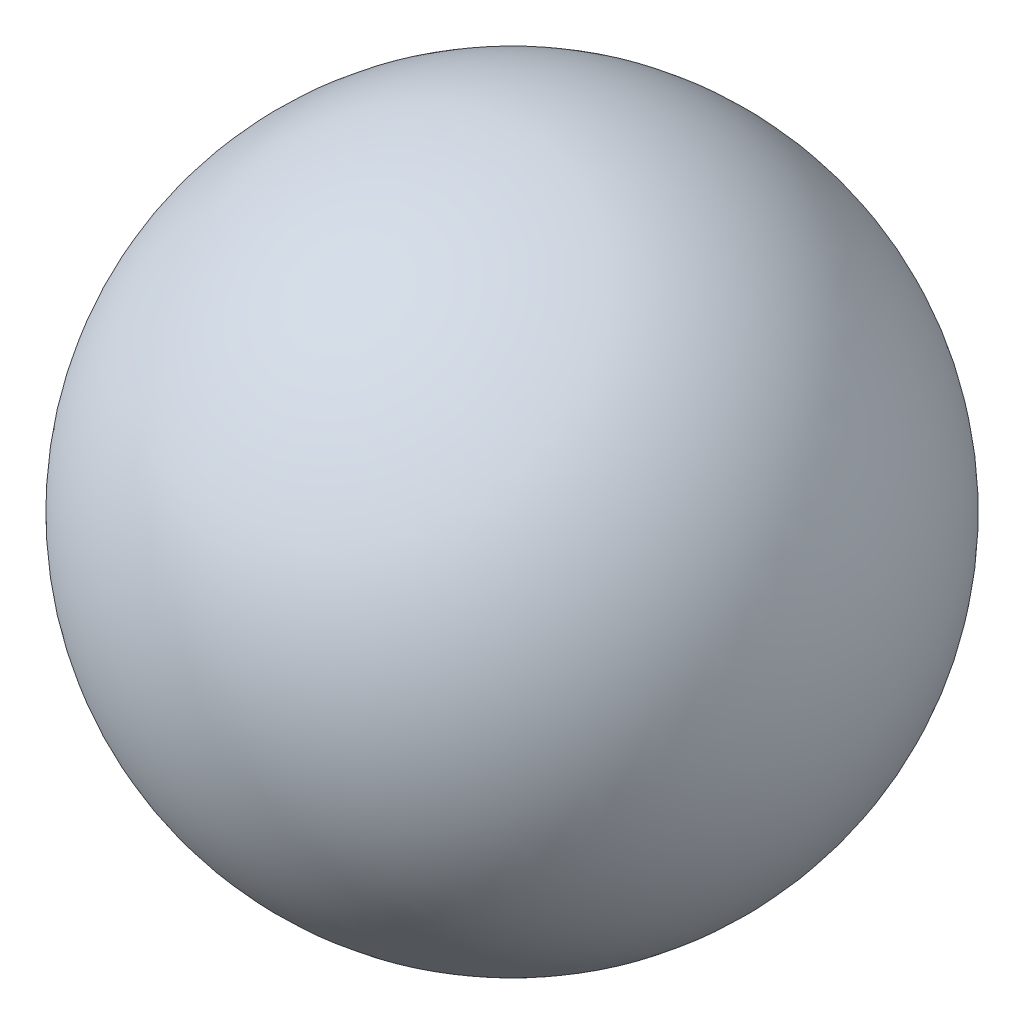
ISO-10303-21;
HEADER;
FILE_DESCRIPTION(('STEP AP214'),'2;1');
FILE_NAME('part.step','',(''),(''),'','','');
FILE_SCHEMA(('AUTOMOTIVE_DESIGN { 1 0 10303 214 1 1 1 1 }'));
ENDSEC;
DATA;
#1=APPLICATION_CONTEXT('core data for automotive mechanical design processes');
#2=APPLICATION_PROTOCOL_DEFINITION('international standard','automotive_design',2000,#1);
#3=PRODUCT_CONTEXT('',#1,'mechanical');
#4=PRODUCT('Part','Part','',(#3));
#5=PRODUCT_RELATED_PRODUCT_CATEGORY('part','',(#4));
#6=PRODUCT_DEFINITION_FORMATION('','',#4);
#7=PRODUCT_DEFINITION_CONTEXT('part definition',#1,'design');
#8=PRODUCT_DEFINITION('design','',#6,#7);
#9=PRODUCT_DEFINITION_SHAPE('','',#8);
#10=(LENGTH_UNIT() NAMED_UNIT(*) SI_UNIT(.MILLI.,.METRE.));
#11=(NAMED_UNIT(*) PLANE_ANGLE_UNIT() SI_UNIT($,.RADIAN.));
#12=(NAMED_UNIT(*) SI_UNIT($,.STERADIAN.) SOLID_ANGLE_UNIT());
#13=UNCERTAINTY_MEASURE_WITH_UNIT(LENGTH_MEASURE(1.E-05),#10,'distance_accuracy_value','');
#14=(GEOMETRIC_REPRESENTATION_CONTEXT(3) GLOBAL_UNCERTAINTY_ASSIGNED_CONTEXT((#13)) GLOBAL_UNIT_ASSIGNED_CONTEXT((#10,
#11,#12)) REPRESENTATION_CONTEXT('',''));
#15=CARTESIAN_POINT('',(0.,0.,0.));
#16=DIRECTION('',(0.,0.,1.));
#17=DIRECTION('',(1.,0.,0.));
#18=AXIS2_PLACEMENT_3D('',#15,#16,#17);
#19=CARTESIAN_POINT('',(0.,0.,0.));
#20=DIRECTION('',(0.,1.,0.));
#21=DIRECTION('',(1.,0.,0.));
#22=AXIS2_PLACEMENT_3D('',#19,#20,#21);
#23=SPHERICAL_SURFACE('',#22,21.5);
#24=CARTESIAN_POINT('',(0.,21.5,0.));
#25=VERTEX_POINT('',#24);
#26=VERTEX_LOOP('',#25);
#27=FACE_BOUND('',#26,.T.);
#28=ADVANCED_FACE('F33',(#27),#23,.T.);
#29=CLOSED_SHELL('',(#28));
#30=CARTESIAN_POINT('',(0.,0.,0.));
#31=DIRECTION('',(0.,1.,0.));
#32=DIRECTION('',(-1.,0.,0.));
#33=AXIS2_PLACEMENT_3D('',#30,#31,#32);
#34=SPHERICAL_SURFACE('',#33,16.75);
#35=CARTESIAN_POINT('',(0.,16.75,0.));
#36=VERTEX_POINT('',#35);
#37=VERTEX_LOOP('',#36);
#38=FACE_BOUND('',#37,.T.);
#39=ADVANCED_FACE('F46',(#38),#34,.F.);
#40=CLOSED_SHELL('',(#39));
#41=ORIENTED_CLOSED_SHELL('',*,#40,.T.);
#42=BREP_WITH_VOIDS('B2',#29,(#41));
#43=ADVANCED_BREP_SHAPE_REPRESENTATION('',(#18,#42),#14);
#44=SHAPE_DEFINITION_REPRESENTATION(#9,#43);
ENDSEC;
END-ISO-10303-21;
